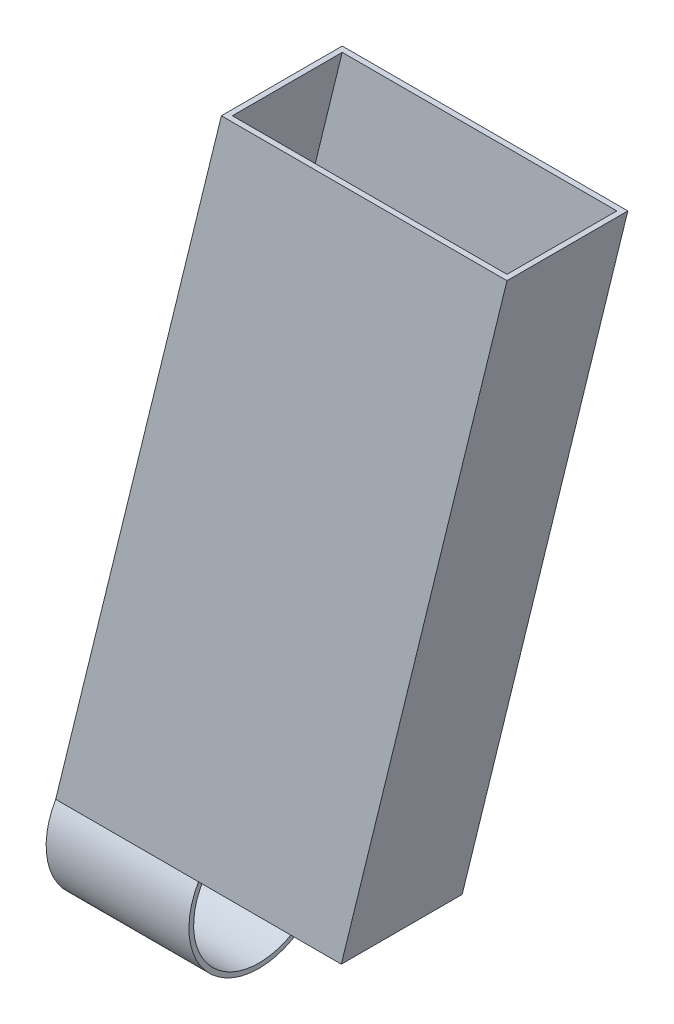
ISO-10303-21;
HEADER;
FILE_DESCRIPTION(('STEP AP214'),'2;1');
FILE_NAME('part.step','',(''),(''),'','','');
FILE_SCHEMA(('AUTOMOTIVE_DESIGN { 1 0 10303 214 1 1 1 1 }'));
ENDSEC;
DATA;
#1=APPLICATION_CONTEXT('core data for automotive mechanical design processes');
#2=APPLICATION_PROTOCOL_DEFINITION('international standard','automotive_design',2000,#1);
#3=PRODUCT_CONTEXT('',#1,'mechanical');
#4=PRODUCT('Part','Part','',(#3));
#5=PRODUCT_RELATED_PRODUCT_CATEGORY('part','',(#4));
#6=PRODUCT_DEFINITION_FORMATION('','',#4);
#7=PRODUCT_DEFINITION_CONTEXT('part definition',#1,'design');
#8=PRODUCT_DEFINITION('design','',#6,#7);
#9=PRODUCT_DEFINITION_SHAPE('','',#8);
#10=(LENGTH_UNIT() NAMED_UNIT(*) SI_UNIT(.MILLI.,.METRE.));
#11=(NAMED_UNIT(*) PLANE_ANGLE_UNIT() SI_UNIT($,.RADIAN.));
#12=(NAMED_UNIT(*) SI_UNIT($,.STERADIAN.) SOLID_ANGLE_UNIT());
#13=UNCERTAINTY_MEASURE_WITH_UNIT(LENGTH_MEASURE(1.E-05),#10,'distance_accuracy_value','');
#14=(GEOMETRIC_REPRESENTATION_CONTEXT(3) GLOBAL_UNCERTAINTY_ASSIGNED_CONTEXT((#13)) GLOBAL_UNIT_ASSIGNED_CONTEXT((#10,
#11,#12)) REPRESENTATION_CONTEXT('',''));
#15=CARTESIAN_POINT('',(0.,0.,0.));
#16=DIRECTION('',(0.,0.,1.));
#17=DIRECTION('',(1.,0.,0.));
#18=AXIS2_PLACEMENT_3D('',#15,#16,#17);
#19=CARTESIAN_POINT('',(0.,0.,0.));
#20=DIRECTION('',(0.,1.,0.));
#21=DIRECTION('',(0.,0.,1.));
#22=AXIS2_PLACEMENT_3D('',#19,#20,#21);
#23=PLANE('',#22);
#24=DIRECTION('',(0.,0.,1.));
#25=VECTOR('',#24,1.);
#26=CARTESIAN_POINT('',(-12.5,0.,-5.));
#27=LINE('',#26,#25);
#28=CARTESIAN_POINT('',(-12.5,0.,5.));
#29=VERTEX_POINT('',#28);
#30=CARTESIAN_POINT('',(-12.5,0.,-5.));
#31=VERTEX_POINT('',#30);
#32=EDGE_CURVE('E215',#29,#31,#27,.F.);
#33=ORIENTED_EDGE('',*,*,#32,.F.);
#34=DIRECTION('',(1.,0.,0.));
#35=VECTOR('',#34,1.);
#36=CARTESIAN_POINT('',(-13.,0.,5.));
#37=LINE('',#36,#35);
#38=CARTESIAN_POINT('',(-13.,0.,5.));
#39=VERTEX_POINT('',#38);
#40=EDGE_CURVE('E162',#39,#29,#37,.T.);
#41=ORIENTED_EDGE('',*,*,#40,.F.);
#42=DIRECTION('',(0.,0.,1.));
#43=VECTOR('',#42,1.);
#44=CARTESIAN_POINT('',(-13.,0.,-5.5));
#45=LINE('',#44,#43);
#46=CARTESIAN_POINT('',(-13.,0.,-5.));
#47=VERTEX_POINT('',#46);
#48=EDGE_CURVE('E116',#47,#39,#45,.T.);
#49=ORIENTED_EDGE('',*,*,#48,.F.);
#50=DIRECTION('',(1.,0.,0.));
#51=VECTOR('',#50,1.);
#52=CARTESIAN_POINT('',(-13.,0.,-5.));
#53=LINE('',#52,#51);
#54=EDGE_CURVE('E124',#47,#31,#53,.T.);
#55=ORIENTED_EDGE('',*,*,#54,.T.);
#56=EDGE_LOOP('',(#33,#41,#49,#55));
#57=FACE_BOUND('',#56,.T.);
#58=ADVANCED_FACE('F35',(#57),#23,.F.);
#59=CARTESIAN_POINT('',(-13.,0.,-5.5));
#60=DIRECTION('',(-0.971158066616251,0.23843659460365,0.));
#61=DIRECTION('',(-0.23843659460365,-0.971158066616251,0.));
#62=AXIS2_PLACEMENT_3D('',#59,#60,#61);
#63=PLANE('',#62);
#64=DIRECTION('',(0.23843659460365,0.971158066616251,0.));
#65=VECTOR('',#64,1.);
#66=CARTESIAN_POINT('',(-13.,0.,5.50000000000001));
#67=LINE('',#66,#65);
#68=CARTESIAN_POINT('',(-13.,0.,5.50000000000001));
#69=VERTEX_POINT('',#68);
#70=CARTESIAN_POINT('',(2.08144611725176,61.4270979559743,5.50000000000001));
#71=VERTEX_POINT('',#70);
#72=EDGE_CURVE('E120',#69,#71,#67,.T.);
#73=ORIENTED_EDGE('',*,*,#72,.T.);
#74=DIRECTION('',(0.,0.,1.));
#75=VECTOR('',#74,1.);
#76=CARTESIAN_POINT('',(2.08144611725176,61.4270979559743,-5.5));
#77=LINE('',#76,#75);
#78=CARTESIAN_POINT('',(2.08144611725176,61.4270979559743,-5.5));
#79=VERTEX_POINT('',#78);
#80=EDGE_CURVE('E133',#79,#71,#77,.T.);
#81=ORIENTED_EDGE('',*,*,#80,.F.);
#82=DIRECTION('',(0.23843659460365,0.971158066616251,0.));
#83=VECTOR('',#82,1.);
#84=CARTESIAN_POINT('',(-13.,0.,-5.5));
#85=LINE('',#84,#83);
#86=CARTESIAN_POINT('',(-13.,0.,-5.50000000000001));
#87=VERTEX_POINT('',#86);
#88=EDGE_CURVE('E123',#87,#79,#85,.T.);
#89=ORIENTED_EDGE('',*,*,#88,.F.);
#90=EDGE_CURVE('E111',#87,#47,#45,.T.);
#91=ORIENTED_EDGE('',*,*,#90,.T.);
#92=ORIENTED_EDGE('',*,*,#48,.T.);
#93=DIRECTION('',(0.,0.,1.));
#94=VECTOR('',#93,1.);
#95=CARTESIAN_POINT('',(-13.,0.,5.50000000000001));
#96=LINE('',#95,#94);
#97=EDGE_CURVE('E150',#39,#69,#96,.T.);
#98=ORIENTED_EDGE('',*,*,#97,.T.);
#99=EDGE_LOOP('',(#73,#81,#89,#91,#92,#98));
#100=FACE_BOUND('',#99,.T.);
#101=ADVANCED_FACE('F147',(#100),#63,.T.);
#102=CARTESIAN_POINT('',(-13.,0.,5.50000000000001));
#103=DIRECTION('',(0.,0.,1.));
#104=DIRECTION('',(1.,0.,0.));
#105=AXIS2_PLACEMENT_3D('',#102,#103,#104);
#106=PLANE('',#105);
#107=DIRECTION('',(0.23843659460365,0.971158066616251,0.));
#108=VECTOR('',#107,1.);
#109=CARTESIAN_POINT('',(13.,0.,5.50000000000001));
#110=LINE('',#109,#108);
#111=CARTESIAN_POINT('',(13.,0.,5.50000000000001));
#112=VERTEX_POINT('',#111);
#113=CARTESIAN_POINT('',(28.0814461172518,61.4270979559743,5.50000000000001));
#114=VERTEX_POINT('',#113);
#115=EDGE_CURVE('E94',#112,#114,#110,.T.);
#116=ORIENTED_EDGE('',*,*,#115,.T.);
#117=DIRECTION('',(1.,0.,0.));
#118=VECTOR('',#117,1.);
#119=CARTESIAN_POINT('',(2.08144611725176,61.4270979559743,5.50000000000001));
#120=LINE('',#119,#118);
#121=EDGE_CURVE('E113',#71,#114,#120,.T.);
#122=ORIENTED_EDGE('',*,*,#121,.F.);
#123=ORIENTED_EDGE('',*,*,#72,.F.);
#124=DIRECTION('',(1.,0.,0.));
#125=VECTOR('',#124,1.);
#126=CARTESIAN_POINT('',(-13.,0.,5.50000000000001));
#127=LINE('',#126,#125);
#128=CARTESIAN_POINT('',(0.,0.,5.50000000000001));
#129=VERTEX_POINT('',#128);
#130=EDGE_CURVE('E139',#69,#129,#127,.T.);
#131=ORIENTED_EDGE('',*,*,#130,.T.);
#132=EDGE_CURVE('E98',#129,#112,#127,.T.);
#133=ORIENTED_EDGE('',*,*,#132,.T.);
#134=EDGE_LOOP('',(#116,#122,#123,#131,#133));
#135=FACE_BOUND('',#134,.T.);
#136=ADVANCED_FACE('F127',(#135),#106,.T.);
#137=CARTESIAN_POINT('',(13.,0.,-5.5));
#138=DIRECTION('',(0.971158066616251,-0.23843659460365,0.));
#139=DIRECTION('',(0.23843659460365,0.971158066616251,0.));
#140=AXIS2_PLACEMENT_3D('',#137,#138,#139);
#141=PLANE('',#140);
#142=DIRECTION('',(0.23843659460365,0.971158066616251,0.));
#143=VECTOR('',#142,1.);
#144=CARTESIAN_POINT('',(13.,0.,-5.5));
#145=LINE('',#144,#143);
#146=CARTESIAN_POINT('',(13.,0.,-5.5));
#147=VERTEX_POINT('',#146);
#148=CARTESIAN_POINT('',(28.0814461172518,61.4270979559743,-5.5));
#149=VERTEX_POINT('',#148);
#150=EDGE_CURVE('E39',#147,#149,#145,.T.);
#151=ORIENTED_EDGE('',*,*,#150,.T.);
#152=DIRECTION('',(0.,0.,-1.));
#153=VECTOR('',#152,1.);
#154=CARTESIAN_POINT('',(28.0814461172518,61.4270979559743,-5.5));
#155=LINE('',#154,#153);
#156=EDGE_CURVE('E110',#114,#149,#155,.T.);
#157=ORIENTED_EDGE('',*,*,#156,.F.);
#158=ORIENTED_EDGE('',*,*,#115,.F.);
#159=DIRECTION('',(0.,0.,-1.));
#160=VECTOR('',#159,1.);
#161=CARTESIAN_POINT('',(13.,0.,-5.5));
#162=LINE('',#161,#160);
#163=EDGE_CURVE('E89',#112,#147,#162,.T.);
#164=ORIENTED_EDGE('',*,*,#163,.T.);
#165=EDGE_LOOP('',(#151,#157,#158,#164));
#166=FACE_BOUND('',#165,.T.);
#167=ADVANCED_FACE('F91',(#166),#141,.T.);
#168=CARTESIAN_POINT('',(-13.,0.,-5.5));
#169=DIRECTION('',(0.,0.,-1.));
#170=DIRECTION('',(-1.,0.,0.));
#171=AXIS2_PLACEMENT_3D('',#168,#169,#170);
#172=PLANE('',#171);
#173=DIRECTION('',(-1.,0.,0.));
#174=VECTOR('',#173,1.);
#175=CARTESIAN_POINT('',(2.08144611725176,61.4270979559743,-5.5));
#176=LINE('',#175,#174);
#177=EDGE_CURVE('E107',#149,#79,#176,.T.);
#178=ORIENTED_EDGE('',*,*,#177,.F.);
#179=ORIENTED_EDGE('',*,*,#150,.F.);
#180=DIRECTION('',(-1.,0.,0.));
#181=VECTOR('',#180,1.);
#182=CARTESIAN_POINT('',(-13.,0.,-5.5));
#183=LINE('',#182,#181);
#184=CARTESIAN_POINT('',(0.,0.,-5.50000000000001));
#185=VERTEX_POINT('',#184);
#186=EDGE_CURVE('E104',#147,#185,#183,.T.);
#187=ORIENTED_EDGE('',*,*,#186,.T.);
#188=DIRECTION('',(1.,0.,0.));
#189=VECTOR('',#188,1.);
#190=CARTESIAN_POINT('',(-13.,0.,-5.50000000000001));
#191=LINE('',#190,#189);
#192=EDGE_CURVE('E232',#87,#185,#191,.T.);
#193=ORIENTED_EDGE('',*,*,#192,.F.);
#194=ORIENTED_EDGE('',*,*,#88,.T.);
#195=EDGE_LOOP('',(#178,#179,#187,#193,#194));
#196=FACE_BOUND('',#195,.T.);
#197=ADVANCED_FACE('F37',(#196),#172,.T.);
#198=ORIENTED_EDGE('',*,*,#132,.F.);
#199=DIRECTION('',(0.,0.,1.));
#200=VECTOR('',#199,1.);
#201=CARTESIAN_POINT('',(0.,0.,5.50000000000001));
#202=LINE('',#201,#200);
#203=CARTESIAN_POINT('',(0.,0.,5.));
#204=VERTEX_POINT('',#203);
#205=EDGE_CURVE('E239',#204,#129,#202,.T.);
#206=ORIENTED_EDGE('',*,*,#205,.F.);
#207=DIRECTION('',(1.,0.,0.));
#208=VECTOR('',#207,1.);
#209=CARTESIAN_POINT('',(-12.5,0.,5.));
#210=LINE('',#209,#208);
#211=CARTESIAN_POINT('',(12.5,0.,5.));
#212=VERTEX_POINT('',#211);
#213=EDGE_CURVE('E138',#212,#204,#210,.F.);
#214=ORIENTED_EDGE('',*,*,#213,.F.);
#215=DIRECTION('',(0.,0.,-1.));
#216=VECTOR('',#215,1.);
#217=CARTESIAN_POINT('',(12.5,0.,-5.));
#218=LINE('',#217,#216);
#219=CARTESIAN_POINT('',(12.5,0.,-5.));
#220=VERTEX_POINT('',#219);
#221=EDGE_CURVE('E214',#220,#212,#218,.F.);
#222=ORIENTED_EDGE('',*,*,#221,.F.);
#223=DIRECTION('',(-1.,0.,0.));
#224=VECTOR('',#223,1.);
#225=CARTESIAN_POINT('',(-12.5,0.,-5.));
#226=LINE('',#225,#224);
#227=CARTESIAN_POINT('',(0.,0.,-5.));
#228=VERTEX_POINT('',#227);
#229=EDGE_CURVE('E216',#228,#220,#226,.F.);
#230=ORIENTED_EDGE('',*,*,#229,.F.);
#231=DIRECTION('',(0.,0.,1.));
#232=VECTOR('',#231,1.);
#233=CARTESIAN_POINT('',(0.,0.,-5.));
#234=LINE('',#233,#232);
#235=EDGE_CURVE('E52',#185,#228,#234,.T.);
#236=ORIENTED_EDGE('',*,*,#235,.F.);
#237=ORIENTED_EDGE('',*,*,#186,.F.);
#238=ORIENTED_EDGE('',*,*,#163,.F.);
#239=EDGE_LOOP('',(#198,#206,#214,#222,#230,#236,#237,#238));
#240=FACE_BOUND('',#239,.T.);
#241=ADVANCED_FACE('F108',(#240),#23,.F.);
#242=CARTESIAN_POINT('',(15.0814461172518,61.4270979559743,0.));
#243=DIRECTION('',(0.,1.,0.));
#244=DIRECTION('',(0.,0.,1.));
#245=AXIS2_PLACEMENT_3D('',#242,#243,#244);
#246=PLANE('',#245);
#247=DIRECTION('',(0.,0.,-1.));
#248=VECTOR('',#247,1.);
#249=CARTESIAN_POINT('',(27.5814461172518,61.4270979559743,-5.));
#250=LINE('',#249,#248);
#251=CARTESIAN_POINT('',(27.5814461172518,61.4270979559743,-5.));
#252=VERTEX_POINT('',#251);
#253=CARTESIAN_POINT('',(27.5814461172518,61.4270979559743,5.));
#254=VERTEX_POINT('',#253);
#255=EDGE_CURVE('E11',#252,#254,#250,.F.);
#256=ORIENTED_EDGE('',*,*,#255,.T.);
#257=DIRECTION('',(1.,0.,0.));
#258=VECTOR('',#257,1.);
#259=CARTESIAN_POINT('',(2.58144611725176,61.4270979559743,5.));
#260=LINE('',#259,#258);
#261=CARTESIAN_POINT('',(2.58144611725176,61.4270979559743,5.));
#262=VERTEX_POINT('',#261);
#263=EDGE_CURVE('E189',#254,#262,#260,.F.);
#264=ORIENTED_EDGE('',*,*,#263,.T.);
#265=DIRECTION('',(0.,0.,1.));
#266=VECTOR('',#265,1.);
#267=CARTESIAN_POINT('',(2.58144611725176,61.4270979559743,-5.));
#268=LINE('',#267,#266);
#269=CARTESIAN_POINT('',(2.58144611725176,61.4270979559743,-5.));
#270=VERTEX_POINT('',#269);
#271=EDGE_CURVE('E191',#262,#270,#268,.F.);
#272=ORIENTED_EDGE('',*,*,#271,.T.);
#273=DIRECTION('',(-1.,0.,0.));
#274=VECTOR('',#273,1.);
#275=CARTESIAN_POINT('',(2.58144611725176,61.4270979559743,-5.));
#276=LINE('',#275,#274);
#277=EDGE_CURVE('E60',#270,#252,#276,.F.);
#278=ORIENTED_EDGE('',*,*,#277,.T.);
#279=EDGE_LOOP('',(#256,#264,#272,#278));
#280=FACE_BOUND('',#279,.T.);
#281=ORIENTED_EDGE('',*,*,#156,.T.);
#282=ORIENTED_EDGE('',*,*,#177,.T.);
#283=ORIENTED_EDGE('',*,*,#80,.T.);
#284=ORIENTED_EDGE('',*,*,#121,.T.);
#285=EDGE_LOOP('',(#281,#282,#283,#284));
#286=FACE_BOUND('',#285,.T.);
#287=ADVANCED_FACE('F132',(#280,#286),#246,.T.);
#288=CARTESIAN_POINT('',(-12.5,0.,5.));
#289=DIRECTION('',(0.,0.,-1.));
#290=DIRECTION('',(-1.,0.,0.));
#291=AXIS2_PLACEMENT_3D('',#288,#289,#290);
#292=PLANE('',#291);
#293=DIRECTION('',(0.23843659460365,0.971158066616251,0.));
#294=VECTOR('',#293,1.);
#295=CARTESIAN_POINT('',(-12.5,0.,5.));
#296=LINE('',#295,#294);
#297=EDGE_CURVE('E196',#29,#262,#296,.T.);
#298=ORIENTED_EDGE('',*,*,#297,.T.);
#299=ORIENTED_EDGE('',*,*,#263,.F.);
#300=DIRECTION('',(0.23843659460365,0.971158066616251,0.));
#301=VECTOR('',#300,1.);
#302=CARTESIAN_POINT('',(12.5,0.,5.));
#303=LINE('',#302,#301);
#304=EDGE_CURVE('E197',#212,#254,#303,.T.);
#305=ORIENTED_EDGE('',*,*,#304,.F.);
#306=ORIENTED_EDGE('',*,*,#213,.T.);
#307=EDGE_CURVE('E209',#29,#204,#37,.T.);
#308=ORIENTED_EDGE('',*,*,#307,.F.);
#309=EDGE_LOOP('',(#298,#299,#305,#306,#308));
#310=FACE_BOUND('',#309,.T.);
#311=ADVANCED_FACE('F207',(#310),#292,.T.);
#312=CARTESIAN_POINT('',(-12.5,0.,-5.));
#313=DIRECTION('',(0.971158066616251,-0.23843659460365,0.));
#314=DIRECTION('',(0.23843659460365,0.971158066616251,0.));
#315=AXIS2_PLACEMENT_3D('',#312,#313,#314);
#316=PLANE('',#315);
#317=DIRECTION('',(0.23843659460365,0.971158066616251,0.));
#318=VECTOR('',#317,1.);
#319=CARTESIAN_POINT('',(-12.5,0.,-5.));
#320=LINE('',#319,#318);
#321=EDGE_CURVE('E204',#31,#270,#320,.T.);
#322=ORIENTED_EDGE('',*,*,#321,.T.);
#323=ORIENTED_EDGE('',*,*,#271,.F.);
#324=ORIENTED_EDGE('',*,*,#297,.F.);
#325=ORIENTED_EDGE('',*,*,#32,.T.);
#326=EDGE_LOOP('',(#322,#323,#324,#325));
#327=FACE_BOUND('',#326,.T.);
#328=ADVANCED_FACE('F202',(#327),#316,.T.);
#329=CARTESIAN_POINT('',(-12.5,0.,-5.));
#330=DIRECTION('',(0.,0.,1.));
#331=DIRECTION('',(1.,0.,0.));
#332=AXIS2_PLACEMENT_3D('',#329,#330,#331);
#333=PLANE('',#332);
#334=DIRECTION('',(0.23843659460365,0.971158066616251,0.));
#335=VECTOR('',#334,1.);
#336=CARTESIAN_POINT('',(12.5,0.,-5.));
#337=LINE('',#336,#335);
#338=EDGE_CURVE('E44',#220,#252,#337,.T.);
#339=ORIENTED_EDGE('',*,*,#338,.T.);
#340=ORIENTED_EDGE('',*,*,#277,.F.);
#341=ORIENTED_EDGE('',*,*,#321,.F.);
#342=EDGE_CURVE('E219',#31,#228,#226,.F.);
#343=ORIENTED_EDGE('',*,*,#342,.T.);
#344=ORIENTED_EDGE('',*,*,#229,.T.);
#345=EDGE_LOOP('',(#339,#340,#341,#343,#344));
#346=FACE_BOUND('',#345,.T.);
#347=ADVANCED_FACE('F256',(#346),#333,.T.);
#348=CARTESIAN_POINT('',(12.5,0.,-5.));
#349=DIRECTION('',(-0.971158066616251,0.23843659460365,0.));
#350=DIRECTION('',(-0.23843659460365,-0.971158066616251,0.));
#351=AXIS2_PLACEMENT_3D('',#348,#349,#350);
#352=PLANE('',#351);
#353=ORIENTED_EDGE('',*,*,#255,.F.);
#354=ORIENTED_EDGE('',*,*,#338,.F.);
#355=ORIENTED_EDGE('',*,*,#221,.T.);
#356=ORIENTED_EDGE('',*,*,#304,.T.);
#357=EDGE_LOOP('',(#353,#354,#355,#356));
#358=FACE_BOUND('',#357,.T.);
#359=ADVANCED_FACE('F228',(#358),#352,.T.);
#360=CARTESIAN_POINT('',(-13.,-3.21538242713792,0.));
#361=DIRECTION('',(1.,0.,0.));
#362=DIRECTION('',(0.,0.,-1.));
#363=AXIS2_PLACEMENT_3D('',#360,#361,#362);
#364=CYLINDRICAL_SURFACE('',#363,5.94463490491614);
#365=CARTESIAN_POINT('',(0.,-3.21538242713792,0.));
#366=DIRECTION('',(-1.,0.,0.));
#367=DIRECTION('',(0.,0.,-1.));
#368=AXIS2_PLACEMENT_3D('',#365,#366,#367);
#369=CIRCLE('',#368,5.94463490491614);
#370=EDGE_CURVE('E242',#228,#204,#369,.T.);
#371=ORIENTED_EDGE('',*,*,#370,.F.);
#372=ORIENTED_EDGE('',*,*,#342,.F.);
#373=ORIENTED_EDGE('',*,*,#54,.F.);
#374=CARTESIAN_POINT('',(-13.,-3.21538242713792,0.));
#375=DIRECTION('',(-1.,0.,0.));
#376=DIRECTION('',(0.,0.,-1.));
#377=AXIS2_PLACEMENT_3D('',#374,#375,#376);
#378=CIRCLE('',#377,5.94463490491614);
#379=EDGE_CURVE('E236',#47,#39,#378,.T.);
#380=ORIENTED_EDGE('',*,*,#379,.T.);
#381=ORIENTED_EDGE('',*,*,#40,.T.);
#382=ORIENTED_EDGE('',*,*,#307,.T.);
#383=EDGE_LOOP('',(#371,#372,#373,#380,#381,#382));
#384=FACE_BOUND('',#383,.T.);
#385=ADVANCED_FACE('F247',(#384),#364,.F.);
#386=CARTESIAN_POINT('',(-13.,-3.21538242713792,0.));
#387=DIRECTION('',(1.,0.,0.));
#388=DIRECTION('',(0.,0.,-1.));
#389=AXIS2_PLACEMENT_3D('',#386,#387,#388);
#390=CYLINDRICAL_SURFACE('',#389,6.37092490559632);
#391=CARTESIAN_POINT('',(0.,-3.21538242713792,0.));
#392=DIRECTION('',(1.,0.,0.));
#393=DIRECTION('',(0.,0.,-1.));
#394=AXIS2_PLACEMENT_3D('',#391,#392,#393);
#395=CIRCLE('',#394,6.37092490559632);
#396=EDGE_CURVE('E237',#129,#185,#395,.T.);
#397=ORIENTED_EDGE('',*,*,#396,.F.);
#398=ORIENTED_EDGE('',*,*,#130,.F.);
#399=CARTESIAN_POINT('',(-13.,-3.21538242713792,0.));
#400=DIRECTION('',(1.,0.,0.));
#401=DIRECTION('',(0.,0.,-1.));
#402=AXIS2_PLACEMENT_3D('',#399,#400,#401);
#403=CIRCLE('',#402,6.37092490559632);
#404=EDGE_CURVE('E244',#69,#87,#403,.T.);
#405=ORIENTED_EDGE('',*,*,#404,.T.);
#406=ORIENTED_EDGE('',*,*,#192,.T.);
#407=EDGE_LOOP('',(#397,#398,#405,#406));
#408=FACE_BOUND('',#407,.T.);
#409=ADVANCED_FACE('F252',(#408),#390,.T.);
#410=CARTESIAN_POINT('',(-13.,-3.21538242713792,0.));
#411=DIRECTION('',(1.,0.,0.));
#412=DIRECTION('',(0.,0.,-1.));
#413=AXIS2_PLACEMENT_3D('',#410,#411,#412);
#414=PLANE('',#413);
#415=ORIENTED_EDGE('',*,*,#379,.F.);
#416=ORIENTED_EDGE('',*,*,#90,.F.);
#417=ORIENTED_EDGE('',*,*,#404,.F.);
#418=ORIENTED_EDGE('',*,*,#97,.F.);
#419=EDGE_LOOP('',(#415,#416,#417,#418));
#420=FACE_BOUND('',#419,.T.);
#421=ADVANCED_FACE('F249',(#420),#414,.F.);
#422=CARTESIAN_POINT('',(0.,-3.21538242713792,0.));
#423=DIRECTION('',(1.,0.,0.));
#424=DIRECTION('',(0.,0.,-1.));
#425=AXIS2_PLACEMENT_3D('',#422,#423,#424);
#426=PLANE('',#425);
#427=ORIENTED_EDGE('',*,*,#370,.T.);
#428=ORIENTED_EDGE('',*,*,#205,.T.);
#429=ORIENTED_EDGE('',*,*,#396,.T.);
#430=ORIENTED_EDGE('',*,*,#235,.T.);
#431=EDGE_LOOP('',(#427,#428,#429,#430));
#432=FACE_BOUND('',#431,.T.);
#433=ADVANCED_FACE('F253',(#432),#426,.T.);
#434=CLOSED_SHELL('',(#58,#101,#136,#167,#197,#241,#287,#311,#328,#347,#359,#385,#409,#421,#433));
#435=MANIFOLD_SOLID_BREP('B2',#434);
#436=ADVANCED_BREP_SHAPE_REPRESENTATION('',(#18,#435),#14);
#437=SHAPE_DEFINITION_REPRESENTATION(#9,#436);
ENDSEC;
END-ISO-10303-21;
